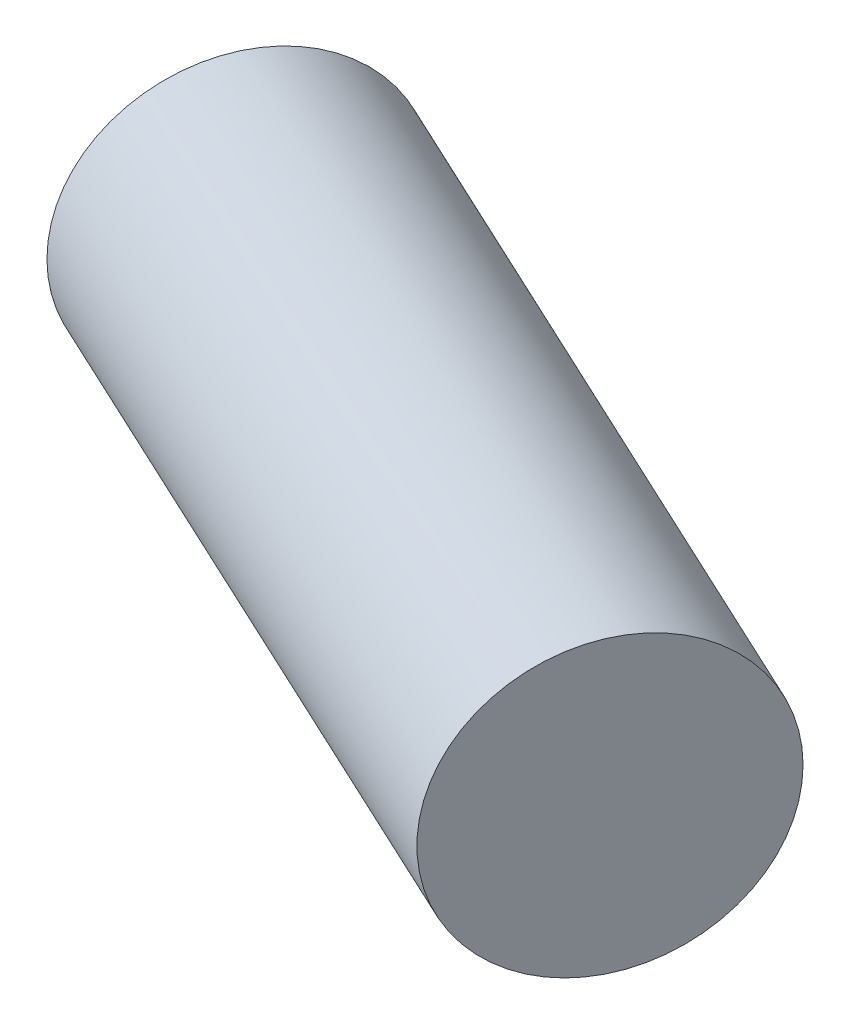
ISO-10303-21;
HEADER;
FILE_DESCRIPTION(('STEP AP214'),'2;1');
FILE_NAME('part.step','',(''),(''),'','','');
FILE_SCHEMA(('AUTOMOTIVE_DESIGN { 1 0 10303 214 1 1 1 1 }'));
ENDSEC;
DATA;
#1=APPLICATION_CONTEXT('core data for automotive mechanical design processes');
#2=APPLICATION_PROTOCOL_DEFINITION('international standard','automotive_design',2000,#1);
#3=PRODUCT_CONTEXT('',#1,'mechanical');
#4=PRODUCT('Part','Part','',(#3));
#5=PRODUCT_RELATED_PRODUCT_CATEGORY('part','',(#4));
#6=PRODUCT_DEFINITION_FORMATION('','',#4);
#7=PRODUCT_DEFINITION_CONTEXT('part definition',#1,'design');
#8=PRODUCT_DEFINITION('design','',#6,#7);
#9=PRODUCT_DEFINITION_SHAPE('','',#8);
#10=(LENGTH_UNIT() NAMED_UNIT(*) SI_UNIT(.MILLI.,.METRE.));
#11=(NAMED_UNIT(*) PLANE_ANGLE_UNIT() SI_UNIT($,.RADIAN.));
#12=(NAMED_UNIT(*) SI_UNIT($,.STERADIAN.) SOLID_ANGLE_UNIT());
#13=UNCERTAINTY_MEASURE_WITH_UNIT(LENGTH_MEASURE(1.E-05),#10,'distance_accuracy_value','');
#14=(GEOMETRIC_REPRESENTATION_CONTEXT(3) GLOBAL_UNCERTAINTY_ASSIGNED_CONTEXT((#13)) GLOBAL_UNIT_ASSIGNED_CONTEXT((#10,
#11,#12)) REPRESENTATION_CONTEXT('',''));
#15=CARTESIAN_POINT('',(0.,0.,0.));
#16=DIRECTION('',(0.,0.,1.));
#17=DIRECTION('',(1.,0.,0.));
#18=AXIS2_PLACEMENT_3D('',#15,#16,#17);
#19=CARTESIAN_POINT('',(-18.6717783894622,116.991397652115,30.7002801031494));
#20=DIRECTION('',(-0.906307787036645,0.,-0.42261826174071));
#21=DIRECTION('',(0.179282618543498,-0.905559714373586,-0.384472816193571));
#22=AXIS2_PLACEMENT_3D('',#19,#20,#21);
#23=PLANE('',#22);
#24=CARTESIAN_POINT('',(-30.2291555585855,101.496948087409,55.4851554252731));
#25=DIRECTION('',(-0.906307787036645,0.,-0.42261826174071));
#26=DIRECTION('',(-0.42261826174071,0.,0.906307787036645));
#27=AXIS2_PLACEMENT_3D('',#24,#25,#26);
#28=CIRCLE('',#27,1.50000000000157);
#29=CARTESIAN_POINT('',(-30.8630829511972,101.496948087409,56.8446171058295));
#30=VERTEX_POINT('',#29);
#31=EDGE_CURVE('E10',#30,#30,#28,.F.);
#32=ORIENTED_EDGE('',*,*,#31,.F.);
#33=EDGE_LOOP('',(#32));
#34=FACE_BOUND('',#33,.T.);
#35=ADVANCED_FACE('F37',(#34),#23,.T.);
#36=CARTESIAN_POINT('',(-23.073168344779,101.496948087409,58.8220470647304));
#37=DIRECTION('',(0.906307787036646,0.,0.422618261740709));
#38=DIRECTION('',(0.422618261740709,0.,-0.906307787036646));
#39=AXIS2_PLACEMENT_3D('',#36,#37,#38);
#40=PLANE('',#39);
#41=CARTESIAN_POINT('',(-23.073168344779,101.496948087409,58.8220470647304));
#42=DIRECTION('',(0.906307787036646,0.,0.422618261740709));
#43=DIRECTION('',(0.422618261740709,0.,-0.906307787036646));
#44=AXIS2_PLACEMENT_3D('',#41,#42,#43);
#45=CIRCLE('',#44,1.50000000000157);
#46=CARTESIAN_POINT('',(-22.4392409521673,101.496948087409,57.462585384174));
#47=VERTEX_POINT('',#46);
#48=EDGE_CURVE('E43',#47,#47,#45,.T.);
#49=ORIENTED_EDGE('',*,*,#48,.T.);
#50=EDGE_LOOP('',(#49));
#51=FACE_BOUND('',#50,.T.);
#52=ADVANCED_FACE('F49',(#51),#40,.T.);
#53=CARTESIAN_POINT('',(-34.0742938509242,101.496948087409,53.6921379928905));
#54=DIRECTION('',(0.906307787036646,0.,0.422618261740709));
#55=DIRECTION('',(0.422618261740709,0.,-0.906307787036646));
#56=AXIS2_PLACEMENT_3D('',#53,#54,#55);
#57=CYLINDRICAL_SURFACE('',#56,1.50000000000157);
#58=ORIENTED_EDGE('',*,*,#48,.F.);
#59=EDGE_LOOP('',(#58));
#60=FACE_BOUND('',#59,.T.);
#61=ORIENTED_EDGE('',*,*,#31,.T.);
#62=EDGE_LOOP('',(#61));
#63=FACE_BOUND('',#62,.T.);
#64=ADVANCED_FACE('F51',(#60,#63),#57,.T.);
#65=CLOSED_SHELL('',(#35,#52,#64));
#66=MANIFOLD_SOLID_BREP('B2',#65);
#67=ADVANCED_BREP_SHAPE_REPRESENTATION('',(#18,#66),#14);
#68=SHAPE_DEFINITION_REPRESENTATION(#9,#67);
ENDSEC;
END-ISO-10303-21;
